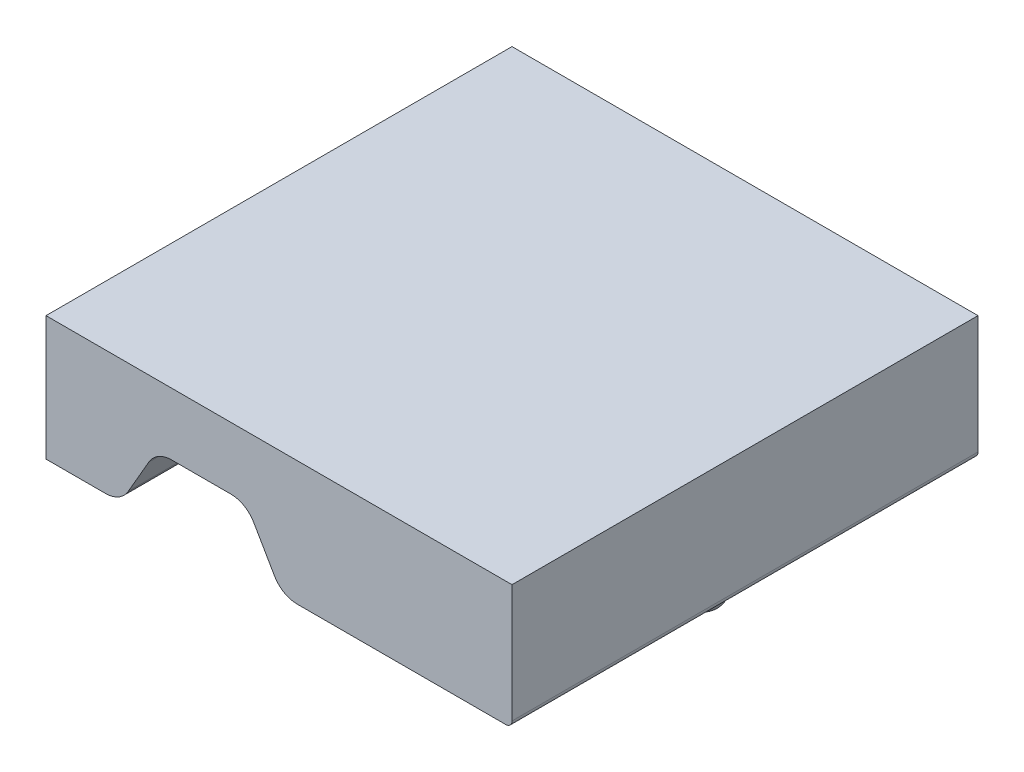
ISO-10303-21;
HEADER;
FILE_DESCRIPTION(('STEP AP214'),'2;1');
FILE_NAME('part.step','',(''),(''),'','','');
FILE_SCHEMA(('AUTOMOTIVE_DESIGN { 1 0 10303 214 1 1 1 1 }'));
ENDSEC;
DATA;
#1=APPLICATION_CONTEXT('core data for automotive mechanical design processes');
#2=APPLICATION_PROTOCOL_DEFINITION('international standard','automotive_design',2000,#1);
#3=PRODUCT_CONTEXT('',#1,'mechanical');
#4=PRODUCT('Part','Part','',(#3));
#5=PRODUCT_RELATED_PRODUCT_CATEGORY('part','',(#4));
#6=PRODUCT_DEFINITION_FORMATION('','',#4);
#7=PRODUCT_DEFINITION_CONTEXT('part definition',#1,'design');
#8=PRODUCT_DEFINITION('design','',#6,#7);
#9=PRODUCT_DEFINITION_SHAPE('','',#8);
#10=(LENGTH_UNIT() NAMED_UNIT(*) SI_UNIT(.MILLI.,.METRE.));
#11=(NAMED_UNIT(*) PLANE_ANGLE_UNIT() SI_UNIT($,.RADIAN.));
#12=(NAMED_UNIT(*) SI_UNIT($,.STERADIAN.) SOLID_ANGLE_UNIT());
#13=UNCERTAINTY_MEASURE_WITH_UNIT(LENGTH_MEASURE(1.E-05),#10,'distance_accuracy_value','');
#14=(GEOMETRIC_REPRESENTATION_CONTEXT(3) GLOBAL_UNCERTAINTY_ASSIGNED_CONTEXT((#13)) GLOBAL_UNIT_ASSIGNED_CONTEXT((#10,
#11,#12)) REPRESENTATION_CONTEXT('',''));
#15=CARTESIAN_POINT('',(0.,0.,0.));
#16=DIRECTION('',(0.,0.,1.));
#17=DIRECTION('',(1.,0.,0.));
#18=AXIS2_PLACEMENT_3D('',#15,#16,#17);
#19=CARTESIAN_POINT('',(-127.,203.2,-381.));
#20=DIRECTION('',(0.,0.,1.));
#21=DIRECTION('',(1.,0.,0.));
#22=AXIS2_PLACEMENT_3D('',#19,#20,#21);
#23=PLANE('',#22);
#24=DIRECTION('',(0.,-1.,0.));
#25=VECTOR('',#24,1.);
#26=CARTESIAN_POINT('',(635.,203.2,-381.));
#27=LINE('',#26,#25);
#28=CARTESIAN_POINT('',(635.,203.2,-381.));
#29=VERTEX_POINT('',#28);
#30=CARTESIAN_POINT('',(635.,10.16,-381.));
#31=VERTEX_POINT('',#30);
#32=EDGE_CURVE('E303',#29,#31,#27,.T.);
#33=ORIENTED_EDGE('',*,*,#32,.T.);
#34=CARTESIAN_POINT('',(624.84,10.16,-381.));
#35=DIRECTION('',(0.,0.,1.));
#36=DIRECTION('',(1.,0.,0.));
#37=AXIS2_PLACEMENT_3D('',#34,#35,#36);
#38=CIRCLE('',#37,10.16);
#39=CARTESIAN_POINT('',(624.84,0.,-381.));
#40=VERTEX_POINT('',#39);
#41=EDGE_CURVE('E56',#31,#40,#38,.F.);
#42=ORIENTED_EDGE('',*,*,#41,.T.);
#43=DIRECTION('',(-1.,0.,0.));
#44=VECTOR('',#43,1.);
#45=CARTESIAN_POINT('',(-127.,0.,-381.));
#46=LINE('',#45,#44);
#47=CARTESIAN_POINT('',(283.912256160357,0.,-381.));
#48=VERTEX_POINT('',#47);
#49=EDGE_CURVE('E286',#40,#48,#46,.T.);
#50=ORIENTED_EDGE('',*,*,#49,.T.);
#51=CARTESIAN_POINT('',(283.912256160357,43.18,-381.));
#52=DIRECTION('',(0.,0.,1.));
#53=DIRECTION('',(1.,0.,0.));
#54=AXIS2_PLACEMENT_3D('',#51,#52,#53);
#55=CIRCLE('',#54,43.18);
#56=CARTESIAN_POINT('',(246.517279224945,21.59,-381.));
#57=VERTEX_POINT('',#56);
#58=EDGE_CURVE('E359',#48,#57,#55,.F.);
#59=ORIENTED_EDGE('',*,*,#58,.T.);
#60=DIRECTION('',(-0.500000000000001,0.866025403784438,0.));
#61=VECTOR('',#60,1.);
#62=CARTESIAN_POINT('',(273.646968374165,-25.4000000000001,-381.));
#63=LINE('',#62,#61);
#64=CARTESIAN_POINT('',(212.788476498887,80.0100000000001,-381.));
#65=VERTEX_POINT('',#64);
#66=EDGE_CURVE('E242',#57,#65,#63,.T.);
#67=ORIENTED_EDGE('',*,*,#66,.T.);
#68=CARTESIAN_POINT('',(175.393499563474,58.42,-381.));
#69=DIRECTION('',(0.,0.,1.));
#70=DIRECTION('',(1.,0.,0.));
#71=AXIS2_PLACEMENT_3D('',#68,#69,#70);
#72=CIRCLE('',#71,43.18);
#73=CARTESIAN_POINT('',(175.393499563474,101.6,-381.));
#74=VERTEX_POINT('',#73);
#75=EDGE_CURVE('E394',#65,#74,#72,.T.);
#76=ORIENTED_EDGE('',*,*,#75,.T.);
#77=DIRECTION('',(-1.,0.,0.));
#78=VECTOR('',#77,1.);
#79=CARTESIAN_POINT('',(200.323484187082,101.6,-381.));
#80=LINE('',#79,#78);
#81=CARTESIAN_POINT('',(78.6065004365256,101.6,-381.));
#82=VERTEX_POINT('',#81);
#83=EDGE_CURVE('E250',#74,#82,#80,.T.);
#84=ORIENTED_EDGE('',*,*,#83,.T.);
#85=CARTESIAN_POINT('',(78.6065004365255,58.42,-381.));
#86=DIRECTION('',(0.,0.,1.));
#87=DIRECTION('',(1.,0.,0.));
#88=AXIS2_PLACEMENT_3D('',#85,#86,#87);
#89=CIRCLE('',#88,43.18);
#90=CARTESIAN_POINT('',(41.2115235011134,80.0099999999999,-381.));
#91=VERTEX_POINT('',#90);
#92=EDGE_CURVE('E389',#82,#91,#89,.T.);
#93=ORIENTED_EDGE('',*,*,#92,.T.);
#94=DIRECTION('',(-0.499999999999999,-0.866025403784439,0.));
#95=VECTOR('',#94,1.);
#96=CARTESIAN_POINT('',(53.6765158129175,101.6,-381.));
#97=LINE('',#96,#95);
#98=CARTESIAN_POINT('',(7.48272077505559,21.59,-381.));
#99=VERTEX_POINT('',#98);
#100=EDGE_CURVE('E259',#91,#99,#97,.T.);
#101=ORIENTED_EDGE('',*,*,#100,.T.);
#102=CARTESIAN_POINT('',(-29.9122561603565,43.18,-381.));
#103=DIRECTION('',(0.,0.,1.));
#104=DIRECTION('',(1.,0.,0.));
#105=AXIS2_PLACEMENT_3D('',#102,#103,#104);
#106=CIRCLE('',#105,43.18);
#107=CARTESIAN_POINT('',(-29.9122561603565,0.,-381.));
#108=VERTEX_POINT('',#107);
#109=EDGE_CURVE('E361',#99,#108,#106,.F.);
#110=ORIENTED_EDGE('',*,*,#109,.T.);
#111=CARTESIAN_POINT('',(-127.,0.,-381.));
#112=VERTEX_POINT('',#111);
#113=EDGE_CURVE('E299',#108,#112,#46,.T.);
#114=ORIENTED_EDGE('',*,*,#113,.T.);
#115=DIRECTION('',(0.,-1.,0.));
#116=VECTOR('',#115,1.);
#117=CARTESIAN_POINT('',(-127.,203.2,-381.));
#118=LINE('',#117,#116);
#119=CARTESIAN_POINT('',(-127.,203.2,-381.));
#120=VERTEX_POINT('',#119);
#121=EDGE_CURVE('E292',#120,#112,#118,.T.);
#122=ORIENTED_EDGE('',*,*,#121,.F.);
#123=DIRECTION('',(-1.,0.,0.));
#124=VECTOR('',#123,1.);
#125=CARTESIAN_POINT('',(-127.,203.2,-381.));
#126=LINE('',#125,#124);
#127=EDGE_CURVE('E290',#29,#120,#126,.T.);
#128=ORIENTED_EDGE('',*,*,#127,.F.);
#129=EDGE_LOOP('',(#33,#42,#50,#59,#67,#76,#84,#93,#101,#110,#114,#122,#128));
#130=FACE_BOUND('',#129,.T.);
#131=ADVANCED_FACE('F34',(#130),#23,.F.);
#132=CARTESIAN_POINT('',(0.,0.,0.));
#133=DIRECTION('',(0.,1.,0.));
#134=DIRECTION('',(0.,0.,1.));
#135=AXIS2_PLACEMENT_3D('',#132,#133,#134);
#136=PLANE('',#135);
#137=CARTESIAN_POINT('',(558.8,0.,0.));
#138=DIRECTION('',(0.,1.,0.));
#139=DIRECTION('',(0.,0.,1.));
#140=AXIS2_PLACEMENT_3D('',#137,#138,#139);
#141=CIRCLE('',#140,50.8);
#142=CARTESIAN_POINT('',(558.8,0.,50.8));
#143=VERTEX_POINT('',#142);
#144=EDGE_CURVE('E396',#143,#143,#141,.F.);
#145=ORIENTED_EDGE('',*,*,#144,.F.);
#146=EDGE_LOOP('',(#145));
#147=FACE_BOUND('',#146,.T.);
#148=DIRECTION('',(1.,0.,0.));
#149=VECTOR('',#148,1.);
#150=CARTESIAN_POINT('',(25.4000000000001,0.,-254.));
#151=LINE('',#150,#149);
#152=CARTESIAN_POINT('',(25.4000000000001,0.,-254.));
#153=VERTEX_POINT('',#152);
#154=CARTESIAN_POINT('',(228.6,0.,-254.));
#155=VERTEX_POINT('',#154);
#156=EDGE_CURVE('E236',#153,#155,#151,.T.);
#157=ORIENTED_EDGE('',*,*,#156,.F.);
#158=DIRECTION('',(0.,0.,-1.));
#159=VECTOR('',#158,1.);
#160=CARTESIAN_POINT('',(25.4000000000001,0.,254.));
#161=LINE('',#160,#159);
#162=CARTESIAN_POINT('',(25.4000000000001,0.,254.));
#163=VERTEX_POINT('',#162);
#164=EDGE_CURVE('E207',#163,#153,#161,.T.);
#165=ORIENTED_EDGE('',*,*,#164,.F.);
#166=DIRECTION('',(-1.,0.,0.));
#167=VECTOR('',#166,1.);
#168=CARTESIAN_POINT('',(25.4000000000001,0.,254.));
#169=LINE('',#168,#167);
#170=CARTESIAN_POINT('',(228.6,0.,254.));
#171=VERTEX_POINT('',#170);
#172=EDGE_CURVE('E224',#171,#163,#169,.T.);
#173=ORIENTED_EDGE('',*,*,#172,.F.);
#174=DIRECTION('',(0.,0.,1.));
#175=VECTOR('',#174,1.);
#176=CARTESIAN_POINT('',(228.6,0.,254.));
#177=LINE('',#176,#175);
#178=EDGE_CURVE('E227',#155,#171,#177,.T.);
#179=ORIENTED_EDGE('',*,*,#178,.F.);
#180=EDGE_LOOP('',(#157,#165,#173,#179));
#181=FACE_BOUND('',#180,.T.);
#182=ORIENTED_EDGE('',*,*,#49,.F.);
#183=DIRECTION('',(0.,0.,-1.));
#184=VECTOR('',#183,1.);
#185=CARTESIAN_POINT('',(624.84,0.,0.));
#186=LINE('',#185,#184);
#187=CARTESIAN_POINT('',(624.84,0.,381.));
#188=VERTEX_POINT('',#187);
#189=EDGE_CURVE('E42',#40,#188,#186,.F.);
#190=ORIENTED_EDGE('',*,*,#189,.T.);
#191=DIRECTION('',(1.,0.,0.));
#192=VECTOR('',#191,1.);
#193=CARTESIAN_POINT('',(-127.,0.,381.));
#194=LINE('',#193,#192);
#195=CARTESIAN_POINT('',(283.912256160357,0.,381.));
#196=VERTEX_POINT('',#195);
#197=EDGE_CURVE('E295',#196,#188,#194,.T.);
#198=ORIENTED_EDGE('',*,*,#197,.F.);
#199=DIRECTION('',(0.,0.,-1.));
#200=VECTOR('',#199,1.);
#201=CARTESIAN_POINT('',(283.912256160357,0.,0.));
#202=LINE('',#201,#200);
#203=CARTESIAN_POINT('',(283.912256160357,0.,279.4));
#204=VERTEX_POINT('',#203);
#205=EDGE_CURVE('E342',#196,#204,#202,.T.);
#206=ORIENTED_EDGE('',*,*,#205,.T.);
#207=DIRECTION('',(1.,0.,0.));
#208=VECTOR('',#207,1.);
#209=CARTESIAN_POINT('',(0.,0.,279.4));
#210=LINE('',#209,#208);
#211=CARTESIAN_POINT('',(-29.9122561603565,0.,279.4));
#212=VERTEX_POINT('',#211);
#213=EDGE_CURVE('E311',#212,#204,#210,.T.);
#214=ORIENTED_EDGE('',*,*,#213,.F.);
#215=DIRECTION('',(0.,0.,1.));
#216=VECTOR('',#215,1.);
#217=CARTESIAN_POINT('',(-29.9122561603565,0.,0.));
#218=LINE('',#217,#216);
#219=CARTESIAN_POINT('',(-29.9122561603565,0.,381.));
#220=VERTEX_POINT('',#219);
#221=EDGE_CURVE('E339',#212,#220,#218,.T.);
#222=ORIENTED_EDGE('',*,*,#221,.T.);
#223=CARTESIAN_POINT('',(-127.,0.,381.));
#224=VERTEX_POINT('',#223);
#225=EDGE_CURVE('E296',#224,#220,#194,.T.);
#226=ORIENTED_EDGE('',*,*,#225,.F.);
#227=DIRECTION('',(0.,0.,1.));
#228=VECTOR('',#227,1.);
#229=CARTESIAN_POINT('',(-127.,0.,-381.));
#230=LINE('',#229,#228);
#231=EDGE_CURVE('E274',#112,#224,#230,.T.);
#232=ORIENTED_EDGE('',*,*,#231,.F.);
#233=ORIENTED_EDGE('',*,*,#113,.F.);
#234=DIRECTION('',(0.,0.,-1.));
#235=VECTOR('',#234,1.);
#236=CARTESIAN_POINT('',(-29.9122561603565,0.,-279.4));
#237=LINE('',#236,#235);
#238=CARTESIAN_POINT('',(-29.9122561603565,0.,-279.4));
#239=VERTEX_POINT('',#238);
#240=EDGE_CURVE('E336',#108,#239,#237,.F.);
#241=ORIENTED_EDGE('',*,*,#240,.T.);
#242=DIRECTION('',(-1.,0.,0.));
#243=VECTOR('',#242,1.);
#244=CARTESIAN_POINT('',(0.,0.,-279.4));
#245=LINE('',#244,#243);
#246=CARTESIAN_POINT('',(283.912256160357,0.,-279.4));
#247=VERTEX_POINT('',#246);
#248=EDGE_CURVE('E313',#247,#239,#245,.T.);
#249=ORIENTED_EDGE('',*,*,#248,.F.);
#250=DIRECTION('',(0.,0.,1.));
#251=VECTOR('',#250,1.);
#252=CARTESIAN_POINT('',(283.912256160357,0.,-381.));
#253=LINE('',#252,#251);
#254=EDGE_CURVE('E333',#247,#48,#253,.F.);
#255=ORIENTED_EDGE('',*,*,#254,.T.);
#256=EDGE_LOOP('',(#182,#190,#198,#206,#214,#222,#226,#232,#233,#241,#249,#255));
#257=FACE_BOUND('',#256,.T.);
#258=ADVANCED_FACE('F435',(#147,#181,#257),#136,.F.);
#259=CARTESIAN_POINT('',(-127.,203.2,-381.));
#260=DIRECTION('',(1.,0.,0.));
#261=DIRECTION('',(0.,0.,-1.));
#262=AXIS2_PLACEMENT_3D('',#259,#260,#261);
#263=PLANE('',#262);
#264=ORIENTED_EDGE('',*,*,#231,.T.);
#265=DIRECTION('',(0.,-1.,0.));
#266=VECTOR('',#265,1.);
#267=CARTESIAN_POINT('',(-127.,203.2,381.));
#268=LINE('',#267,#266);
#269=CARTESIAN_POINT('',(-127.,203.2,381.));
#270=VERTEX_POINT('',#269);
#271=EDGE_CURVE('E308',#270,#224,#268,.T.);
#272=ORIENTED_EDGE('',*,*,#271,.F.);
#273=DIRECTION('',(0.,0.,1.));
#274=VECTOR('',#273,1.);
#275=CARTESIAN_POINT('',(-127.,203.2,-381.));
#276=LINE('',#275,#274);
#277=EDGE_CURVE('E282',#120,#270,#276,.T.);
#278=ORIENTED_EDGE('',*,*,#277,.F.);
#279=ORIENTED_EDGE('',*,*,#121,.T.);
#280=EDGE_LOOP('',(#264,#272,#278,#279));
#281=FACE_BOUND('',#280,.T.);
#282=ADVANCED_FACE('F440',(#281),#263,.F.);
#283=CARTESIAN_POINT('',(-127.,203.2,381.));
#284=DIRECTION('',(0.,0.,-1.));
#285=DIRECTION('',(-1.,0.,0.));
#286=AXIS2_PLACEMENT_3D('',#283,#284,#285);
#287=PLANE('',#286);
#288=ORIENTED_EDGE('',*,*,#197,.T.);
#289=CARTESIAN_POINT('',(624.84,10.16,381.));
#290=DIRECTION('',(0.,0.,-1.));
#291=DIRECTION('',(-1.,0.,0.));
#292=AXIS2_PLACEMENT_3D('',#289,#290,#291);
#293=CIRCLE('',#292,10.16);
#294=CARTESIAN_POINT('',(635.,10.16,381.));
#295=VERTEX_POINT('',#294);
#296=EDGE_CURVE('E11',#188,#295,#293,.F.);
#297=ORIENTED_EDGE('',*,*,#296,.T.);
#298=DIRECTION('',(0.,-1.,0.));
#299=VECTOR('',#298,1.);
#300=CARTESIAN_POINT('',(635.,203.2,381.));
#301=LINE('',#300,#299);
#302=CARTESIAN_POINT('',(635.,203.2,381.));
#303=VERTEX_POINT('',#302);
#304=EDGE_CURVE('E305',#303,#295,#301,.T.);
#305=ORIENTED_EDGE('',*,*,#304,.F.);
#306=DIRECTION('',(1.,0.,0.));
#307=VECTOR('',#306,1.);
#308=CARTESIAN_POINT('',(-127.,203.2,381.));
#309=LINE('',#308,#307);
#310=EDGE_CURVE('E285',#270,#303,#309,.T.);
#311=ORIENTED_EDGE('',*,*,#310,.F.);
#312=ORIENTED_EDGE('',*,*,#271,.T.);
#313=ORIENTED_EDGE('',*,*,#225,.T.);
#314=CARTESIAN_POINT('',(-29.9122561603565,43.18,381.));
#315=DIRECTION('',(0.,0.,-1.));
#316=DIRECTION('',(-1.,0.,0.));
#317=AXIS2_PLACEMENT_3D('',#314,#315,#316);
#318=CIRCLE('',#317,43.18);
#319=CARTESIAN_POINT('',(7.48272077505559,21.59,381.));
#320=VERTEX_POINT('',#319);
#321=EDGE_CURVE('E345',#220,#320,#318,.F.);
#322=ORIENTED_EDGE('',*,*,#321,.T.);
#323=DIRECTION('',(-0.499999999999999,-0.866025403784439,0.));
#324=VECTOR('',#323,1.);
#325=CARTESIAN_POINT('',(53.6765158129175,101.6,381.));
#326=LINE('',#325,#324);
#327=CARTESIAN_POINT('',(41.2115235011134,80.0099999999999,381.));
#328=VERTEX_POINT('',#327);
#329=EDGE_CURVE('E268',#328,#320,#326,.T.);
#330=ORIENTED_EDGE('',*,*,#329,.F.);
#331=CARTESIAN_POINT('',(78.6065004365255,58.42,381.));
#332=DIRECTION('',(0.,0.,-1.));
#333=DIRECTION('',(-1.,0.,0.));
#334=AXIS2_PLACEMENT_3D('',#331,#332,#333);
#335=CIRCLE('',#334,43.18);
#336=CARTESIAN_POINT('',(78.6065004365256,101.6,381.));
#337=VERTEX_POINT('',#336);
#338=EDGE_CURVE('E385',#328,#337,#335,.T.);
#339=ORIENTED_EDGE('',*,*,#338,.T.);
#340=DIRECTION('',(-1.,0.,0.));
#341=VECTOR('',#340,1.);
#342=CARTESIAN_POINT('',(200.323484187082,101.6,381.));
#343=LINE('',#342,#341);
#344=CARTESIAN_POINT('',(175.393499563474,101.6,381.));
#345=VERTEX_POINT('',#344);
#346=EDGE_CURVE('E277',#345,#337,#343,.T.);
#347=ORIENTED_EDGE('',*,*,#346,.F.);
#348=CARTESIAN_POINT('',(175.393499563474,58.42,381.));
#349=DIRECTION('',(0.,0.,-1.));
#350=DIRECTION('',(-1.,0.,0.));
#351=AXIS2_PLACEMENT_3D('',#348,#349,#350);
#352=CIRCLE('',#351,43.18);
#353=CARTESIAN_POINT('',(212.788476498887,80.0100000000001,381.));
#354=VERTEX_POINT('',#353);
#355=EDGE_CURVE('E378',#345,#354,#352,.T.);
#356=ORIENTED_EDGE('',*,*,#355,.T.);
#357=DIRECTION('',(-0.500000000000001,0.866025403784438,0.));
#358=VECTOR('',#357,1.);
#359=CARTESIAN_POINT('',(273.646968374165,-25.4000000000001,381.));
#360=LINE('',#359,#358);
#361=CARTESIAN_POINT('',(246.517279224945,21.59,381.));
#362=VERTEX_POINT('',#361);
#363=EDGE_CURVE('E256',#362,#354,#360,.T.);
#364=ORIENTED_EDGE('',*,*,#363,.F.);
#365=CARTESIAN_POINT('',(283.912256160357,43.18,381.));
#366=DIRECTION('',(0.,0.,-1.));
#367=DIRECTION('',(-1.,0.,0.));
#368=AXIS2_PLACEMENT_3D('',#365,#366,#367);
#369=CIRCLE('',#368,43.18);
#370=EDGE_CURVE('E347',#362,#196,#369,.F.);
#371=ORIENTED_EDGE('',*,*,#370,.T.);
#372=EDGE_LOOP('',(#288,#297,#305,#311,#312,#313,#322,#330,#339,#347,#356,#364,#371));
#373=FACE_BOUND('',#372,.T.);
#374=ADVANCED_FACE('F426',(#373),#287,.F.);
#375=CARTESIAN_POINT('',(635.,203.2,-381.));
#376=DIRECTION('',(-1.,0.,0.));
#377=DIRECTION('',(0.,0.,1.));
#378=AXIS2_PLACEMENT_3D('',#375,#376,#377);
#379=PLANE('',#378);
#380=ORIENTED_EDGE('',*,*,#304,.T.);
#381=DIRECTION('',(0.,0.,-1.));
#382=VECTOR('',#381,1.);
#383=CARTESIAN_POINT('',(635.,10.16,-381.));
#384=LINE('',#383,#382);
#385=EDGE_CURVE('E408',#295,#31,#384,.T.);
#386=ORIENTED_EDGE('',*,*,#385,.T.);
#387=ORIENTED_EDGE('',*,*,#32,.F.);
#388=DIRECTION('',(0.,0.,-1.));
#389=VECTOR('',#388,1.);
#390=CARTESIAN_POINT('',(635.,203.2,-381.));
#391=LINE('',#390,#389);
#392=EDGE_CURVE('E288',#303,#29,#391,.T.);
#393=ORIENTED_EDGE('',*,*,#392,.F.);
#394=EDGE_LOOP('',(#380,#386,#387,#393));
#395=FACE_BOUND('',#394,.T.);
#396=ADVANCED_FACE('F414',(#395),#379,.F.);
#397=CARTESIAN_POINT('',(0.,203.2,0.));
#398=DIRECTION('',(0.,1.,0.));
#399=DIRECTION('',(0.,0.,1.));
#400=AXIS2_PLACEMENT_3D('',#397,#398,#399);
#401=PLANE('',#400);
#402=ORIENTED_EDGE('',*,*,#277,.T.);
#403=ORIENTED_EDGE('',*,*,#310,.T.);
#404=ORIENTED_EDGE('',*,*,#392,.T.);
#405=ORIENTED_EDGE('',*,*,#127,.T.);
#406=EDGE_LOOP('',(#402,#403,#404,#405));
#407=FACE_BOUND('',#406,.T.);
#408=ADVANCED_FACE('F423',(#407),#401,.T.);
#409=CARTESIAN_POINT('',(273.646968374165,-25.4000000000001,279.4));
#410=DIRECTION('',(0.866025403784438,0.500000000000001,0.));
#411=DIRECTION('',(-0.500000000000001,0.866025403784438,0.));
#412=AXIS2_PLACEMENT_3D('',#409,#410,#411);
#413=PLANE('',#412);
#414=ORIENTED_EDGE('',*,*,#363,.T.);
#415=DIRECTION('',(0.,0.,1.));
#416=VECTOR('',#415,1.);
#417=CARTESIAN_POINT('',(212.788476498887,80.01,279.4));
#418=LINE('',#417,#416);
#419=CARTESIAN_POINT('',(212.788476498887,80.0100000000001,279.4));
#420=VERTEX_POINT('',#419);
#421=EDGE_CURVE('E327',#354,#420,#418,.F.);
#422=ORIENTED_EDGE('',*,*,#421,.T.);
#423=DIRECTION('',(-0.500000000000001,0.866025403784438,0.));
#424=VECTOR('',#423,1.);
#425=CARTESIAN_POINT('',(273.646968374165,-25.4000000000001,279.4));
#426=LINE('',#425,#424);
#427=CARTESIAN_POINT('',(246.517279224945,21.59,279.4));
#428=VERTEX_POINT('',#427);
#429=EDGE_CURVE('E264',#428,#420,#426,.T.);
#430=ORIENTED_EDGE('',*,*,#429,.F.);
#431=DIRECTION('',(0.,0.,-1.));
#432=VECTOR('',#431,1.);
#433=CARTESIAN_POINT('',(246.517279224945,21.59,279.4));
#434=LINE('',#433,#432);
#435=EDGE_CURVE('E325',#428,#362,#434,.F.);
#436=ORIENTED_EDGE('',*,*,#435,.T.);
#437=EDGE_LOOP('',(#414,#422,#430,#436));
#438=FACE_BOUND('',#437,.T.);
#439=ADVANCED_FACE('F542',(#438),#413,.F.);
#440=CARTESIAN_POINT('',(53.6765158129175,101.6,279.4));
#441=DIRECTION('',(-0.866025403784439,0.499999999999999,0.));
#442=DIRECTION('',(-0.499999999999999,-0.866025403784439,0.));
#443=AXIS2_PLACEMENT_3D('',#440,#441,#442);
#444=PLANE('',#443);
#445=ORIENTED_EDGE('',*,*,#329,.T.);
#446=DIRECTION('',(0.,0.,1.));
#447=VECTOR('',#446,1.);
#448=CARTESIAN_POINT('',(7.48272077505561,21.59,279.4));
#449=LINE('',#448,#447);
#450=CARTESIAN_POINT('',(7.48272077505559,21.59,279.4));
#451=VERTEX_POINT('',#450);
#452=EDGE_CURVE('E352',#320,#451,#449,.F.);
#453=ORIENTED_EDGE('',*,*,#452,.T.);
#454=DIRECTION('',(-0.499999999999999,-0.866025403784439,0.));
#455=VECTOR('',#454,1.);
#456=CARTESIAN_POINT('',(53.6765158129175,101.6,279.4));
#457=LINE('',#456,#455);
#458=CARTESIAN_POINT('',(41.2115235011134,80.0099999999999,279.4));
#459=VERTEX_POINT('',#458);
#460=EDGE_CURVE('E271',#459,#451,#457,.T.);
#461=ORIENTED_EDGE('',*,*,#460,.F.);
#462=DIRECTION('',(0.,0.,1.));
#463=VECTOR('',#462,1.);
#464=CARTESIAN_POINT('',(41.2115235011135,80.01,381.));
#465=LINE('',#464,#463);
#466=EDGE_CURVE('E349',#459,#328,#465,.T.);
#467=ORIENTED_EDGE('',*,*,#466,.T.);
#468=EDGE_LOOP('',(#445,#453,#461,#467));
#469=FACE_BOUND('',#468,.T.);
#470=ADVANCED_FACE('F538',(#469),#444,.F.);
#471=CARTESIAN_POINT('',(0.,0.,279.4));
#472=DIRECTION('',(0.,0.,1.));
#473=DIRECTION('',(1.,0.,0.));
#474=AXIS2_PLACEMENT_3D('',#471,#472,#473);
#475=PLANE('',#474);
#476=CARTESIAN_POINT('',(127.,20.32,279.4));
#477=DIRECTION('',(0.,0.,1.));
#478=DIRECTION('',(1.,0.,0.));
#479=AXIS2_PLACEMENT_3D('',#476,#477,#478);
#480=CIRCLE('',#479,12.7);
#481=CARTESIAN_POINT('',(139.7,20.32,279.4));
#482=VERTEX_POINT('',#481);
#483=EDGE_CURVE('E320',#482,#482,#480,.T.);
#484=ORIENTED_EDGE('',*,*,#483,.F.);
#485=EDGE_LOOP('',(#484));
#486=FACE_BOUND('',#485,.T.);
#487=ORIENTED_EDGE('',*,*,#429,.T.);
#488=CARTESIAN_POINT('',(175.393499563474,58.42,279.4));
#489=DIRECTION('',(0.,0.,1.));
#490=DIRECTION('',(1.,0.,0.));
#491=AXIS2_PLACEMENT_3D('',#488,#489,#490);
#492=CIRCLE('',#491,43.18);
#493=CARTESIAN_POINT('',(175.393499563474,101.6,279.4));
#494=VERTEX_POINT('',#493);
#495=EDGE_CURVE('E331',#420,#494,#492,.T.);
#496=ORIENTED_EDGE('',*,*,#495,.T.);
#497=DIRECTION('',(-1.,0.,0.));
#498=VECTOR('',#497,1.);
#499=CARTESIAN_POINT('',(200.323484187082,101.6,279.4));
#500=LINE('',#499,#498);
#501=CARTESIAN_POINT('',(78.6065004365256,101.6,279.4));
#502=VERTEX_POINT('',#501);
#503=EDGE_CURVE('E267',#494,#502,#500,.T.);
#504=ORIENTED_EDGE('',*,*,#503,.T.);
#505=CARTESIAN_POINT('',(78.6065004365255,58.42,279.4));
#506=DIRECTION('',(0.,0.,1.));
#507=DIRECTION('',(1.,0.,0.));
#508=AXIS2_PLACEMENT_3D('',#505,#506,#507);
#509=CIRCLE('',#508,43.18);
#510=EDGE_CURVE('E329',#502,#459,#509,.T.);
#511=ORIENTED_EDGE('',*,*,#510,.T.);
#512=ORIENTED_EDGE('',*,*,#460,.T.);
#513=CARTESIAN_POINT('',(-29.9122561603565,43.18,279.4));
#514=DIRECTION('',(0.,0.,1.));
#515=DIRECTION('',(1.,0.,0.));
#516=AXIS2_PLACEMENT_3D('',#513,#514,#515);
#517=CIRCLE('',#516,43.18);
#518=EDGE_CURVE('E382',#451,#212,#517,.F.);
#519=ORIENTED_EDGE('',*,*,#518,.T.);
#520=ORIENTED_EDGE('',*,*,#213,.T.);
#521=CARTESIAN_POINT('',(283.912256160357,43.18,279.4));
#522=DIRECTION('',(0.,0.,1.));
#523=DIRECTION('',(1.,0.,0.));
#524=AXIS2_PLACEMENT_3D('',#521,#522,#523);
#525=CIRCLE('',#524,43.18);
#526=EDGE_CURVE('E380',#204,#428,#525,.F.);
#527=ORIENTED_EDGE('',*,*,#526,.T.);
#528=EDGE_LOOP('',(#487,#496,#504,#511,#512,#519,#520,#527));
#529=FACE_BOUND('',#528,.T.);
#530=ADVANCED_FACE('F535',(#486,#529),#475,.T.);
#531=CARTESIAN_POINT('',(200.323484187082,101.6,279.4));
#532=DIRECTION('',(0.,1.,0.));
#533=DIRECTION('',(-1.,0.,0.));
#534=AXIS2_PLACEMENT_3D('',#531,#532,#533);
#535=PLANE('',#534);
#536=ORIENTED_EDGE('',*,*,#503,.F.);
#537=DIRECTION('',(0.,0.,1.));
#538=VECTOR('',#537,1.);
#539=CARTESIAN_POINT('',(175.393499563474,101.6,381.));
#540=LINE('',#539,#538);
#541=EDGE_CURVE('E322',#494,#345,#540,.T.);
#542=ORIENTED_EDGE('',*,*,#541,.T.);
#543=ORIENTED_EDGE('',*,*,#346,.T.);
#544=DIRECTION('',(0.,0.,1.));
#545=VECTOR('',#544,1.);
#546=CARTESIAN_POINT('',(78.6065004365255,101.6,279.4));
#547=LINE('',#546,#545);
#548=EDGE_CURVE('E315',#337,#502,#547,.F.);
#549=ORIENTED_EDGE('',*,*,#548,.T.);
#550=EDGE_LOOP('',(#536,#542,#543,#549));
#551=FACE_BOUND('',#550,.T.);
#552=ADVANCED_FACE('F534',(#551),#535,.F.);
#553=CARTESIAN_POINT('',(273.646968374165,-25.4000000000001,-279.4));
#554=DIRECTION('',(-0.866025403784438,-0.500000000000001,0.));
#555=DIRECTION('',(0.500000000000001,-0.866025403784438,0.));
#556=AXIS2_PLACEMENT_3D('',#553,#554,#555);
#557=PLANE('',#556);
#558=ORIENTED_EDGE('',*,*,#66,.F.);
#559=DIRECTION('',(0.,0.,1.));
#560=VECTOR('',#559,1.);
#561=CARTESIAN_POINT('',(246.517279224945,21.59,-279.4));
#562=LINE('',#561,#560);
#563=CARTESIAN_POINT('',(246.517279224945,21.59,-279.4));
#564=VERTEX_POINT('',#563);
#565=EDGE_CURVE('E375',#57,#564,#562,.T.);
#566=ORIENTED_EDGE('',*,*,#565,.T.);
#567=DIRECTION('',(-0.500000000000001,0.866025403784438,0.));
#568=VECTOR('',#567,1.);
#569=CARTESIAN_POINT('',(273.646968374165,-25.4000000000001,-279.4));
#570=LINE('',#569,#568);
#571=CARTESIAN_POINT('',(212.788476498887,80.0100000000001,-279.4));
#572=VERTEX_POINT('',#571);
#573=EDGE_CURVE('E246',#564,#572,#570,.T.);
#574=ORIENTED_EDGE('',*,*,#573,.T.);
#575=DIRECTION('',(0.,0.,-1.));
#576=VECTOR('',#575,1.);
#577=CARTESIAN_POINT('',(212.788476498887,80.01,-381.));
#578=LINE('',#577,#576);
#579=EDGE_CURVE('E372',#572,#65,#578,.T.);
#580=ORIENTED_EDGE('',*,*,#579,.T.);
#581=EDGE_LOOP('',(#558,#566,#574,#580));
#582=FACE_BOUND('',#581,.T.);
#583=ADVANCED_FACE('F501',(#582),#557,.T.);
#584=CARTESIAN_POINT('',(53.6765158129175,101.6,-279.4));
#585=DIRECTION('',(0.866025403784439,-0.499999999999999,0.));
#586=DIRECTION('',(0.499999999999999,0.866025403784439,0.));
#587=AXIS2_PLACEMENT_3D('',#584,#585,#586);
#588=PLANE('',#587);
#589=DIRECTION('',(-0.499999999999999,-0.866025403784439,0.));
#590=VECTOR('',#589,1.);
#591=CARTESIAN_POINT('',(53.6765158129175,101.6,-279.4));
#592=LINE('',#591,#590);
#593=CARTESIAN_POINT('',(41.2115235011134,80.0099999999999,-279.4));
#594=VERTEX_POINT('',#593);
#595=CARTESIAN_POINT('',(7.48272077505559,21.59,-279.4));
#596=VERTEX_POINT('',#595);
#597=EDGE_CURVE('E249',#594,#596,#592,.T.);
#598=ORIENTED_EDGE('',*,*,#597,.T.);
#599=DIRECTION('',(0.,0.,-1.));
#600=VECTOR('',#599,1.);
#601=CARTESIAN_POINT('',(7.48272077505561,21.59,-381.));
#602=LINE('',#601,#600);
#603=EDGE_CURVE('E356',#596,#99,#602,.T.);
#604=ORIENTED_EDGE('',*,*,#603,.T.);
#605=ORIENTED_EDGE('',*,*,#100,.F.);
#606=DIRECTION('',(0.,0.,-1.));
#607=VECTOR('',#606,1.);
#608=CARTESIAN_POINT('',(41.2115235011135,80.01,-279.4));
#609=LINE('',#608,#607);
#610=EDGE_CURVE('E354',#91,#594,#609,.F.);
#611=ORIENTED_EDGE('',*,*,#610,.T.);
#612=EDGE_LOOP('',(#598,#604,#605,#611));
#613=FACE_BOUND('',#612,.T.);
#614=ADVANCED_FACE('F512',(#613),#588,.T.);
#615=CARTESIAN_POINT('',(0.,0.,-279.4));
#616=DIRECTION('',(0.,0.,-1.));
#617=DIRECTION('',(1.,0.,0.));
#618=AXIS2_PLACEMENT_3D('',#615,#616,#617);
#619=PLANE('',#618);
#620=CARTESIAN_POINT('',(127.,20.32,-279.4));
#621=DIRECTION('',(0.,0.,-1.));
#622=DIRECTION('',(-1.,0.,0.));
#623=AXIS2_PLACEMENT_3D('',#620,#621,#622);
#624=CIRCLE('',#623,12.7);
#625=CARTESIAN_POINT('',(114.3,20.32,-279.4));
#626=VERTEX_POINT('',#625);
#627=EDGE_CURVE('E230',#626,#626,#624,.T.);
#628=ORIENTED_EDGE('',*,*,#627,.F.);
#629=EDGE_LOOP('',(#628));
#630=FACE_BOUND('',#629,.T.);
#631=ORIENTED_EDGE('',*,*,#597,.F.);
#632=CARTESIAN_POINT('',(78.6065004365255,58.42,-279.4));
#633=DIRECTION('',(0.,0.,-1.));
#634=DIRECTION('',(-1.,0.,0.));
#635=AXIS2_PLACEMENT_3D('',#632,#633,#634);
#636=CIRCLE('',#635,43.18);
#637=CARTESIAN_POINT('',(78.6065004365256,101.6,-279.4));
#638=VERTEX_POINT('',#637);
#639=EDGE_CURVE('E370',#594,#638,#636,.T.);
#640=ORIENTED_EDGE('',*,*,#639,.T.);
#641=DIRECTION('',(-1.,0.,0.));
#642=VECTOR('',#641,1.);
#643=CARTESIAN_POINT('',(200.323484187082,101.6,-279.4));
#644=LINE('',#643,#642);
#645=CARTESIAN_POINT('',(175.393499563474,101.6,-279.4));
#646=VERTEX_POINT('',#645);
#647=EDGE_CURVE('E253',#646,#638,#644,.T.);
#648=ORIENTED_EDGE('',*,*,#647,.F.);
#649=CARTESIAN_POINT('',(175.393499563474,58.42,-279.4));
#650=DIRECTION('',(0.,0.,-1.));
#651=DIRECTION('',(-1.,0.,0.));
#652=AXIS2_PLACEMENT_3D('',#649,#650,#651);
#653=CIRCLE('',#652,43.18);
#654=EDGE_CURVE('E368',#646,#572,#653,.T.);
#655=ORIENTED_EDGE('',*,*,#654,.T.);
#656=ORIENTED_EDGE('',*,*,#573,.F.);
#657=CARTESIAN_POINT('',(283.912256160357,43.18,-279.4));
#658=DIRECTION('',(0.,0.,-1.));
#659=DIRECTION('',(-1.,0.,0.));
#660=AXIS2_PLACEMENT_3D('',#657,#658,#659);
#661=CIRCLE('',#660,43.18);
#662=EDGE_CURVE('E391',#564,#247,#661,.F.);
#663=ORIENTED_EDGE('',*,*,#662,.T.);
#664=ORIENTED_EDGE('',*,*,#248,.T.);
#665=CARTESIAN_POINT('',(-29.9122561603565,43.18,-279.4));
#666=DIRECTION('',(0.,0.,-1.));
#667=DIRECTION('',(-1.,0.,0.));
#668=AXIS2_PLACEMENT_3D('',#665,#666,#667);
#669=CIRCLE('',#668,43.18);
#670=EDGE_CURVE('E387',#239,#596,#669,.F.);
#671=ORIENTED_EDGE('',*,*,#670,.T.);
#672=EDGE_LOOP('',(#631,#640,#648,#655,#656,#663,#664,#671));
#673=FACE_BOUND('',#672,.T.);
#674=ADVANCED_FACE('F498',(#630,#673),#619,.T.);
#675=CARTESIAN_POINT('',(200.323484187082,101.6,-279.4));
#676=DIRECTION('',(0.,-1.,0.));
#677=DIRECTION('',(1.,0.,0.));
#678=AXIS2_PLACEMENT_3D('',#675,#676,#677);
#679=PLANE('',#678);
#680=ORIENTED_EDGE('',*,*,#647,.T.);
#681=DIRECTION('',(0.,0.,-1.));
#682=VECTOR('',#681,1.);
#683=CARTESIAN_POINT('',(78.6065004365255,101.6,-381.));
#684=LINE('',#683,#682);
#685=EDGE_CURVE('E365',#638,#82,#684,.T.);
#686=ORIENTED_EDGE('',*,*,#685,.T.);
#687=ORIENTED_EDGE('',*,*,#83,.F.);
#688=DIRECTION('',(0.,0.,-1.));
#689=VECTOR('',#688,1.);
#690=CARTESIAN_POINT('',(175.393499563474,101.6,-279.4));
#691=LINE('',#690,#689);
#692=EDGE_CURVE('E363',#74,#646,#691,.F.);
#693=ORIENTED_EDGE('',*,*,#692,.T.);
#694=EDGE_LOOP('',(#680,#686,#687,#693));
#695=FACE_BOUND('',#694,.T.);
#696=ADVANCED_FACE('F518',(#695),#679,.T.);
#697=CARTESIAN_POINT('',(25.4000000000001,76.2,254.));
#698=DIRECTION('',(-1.,0.,0.));
#699=DIRECTION('',(0.,0.,1.));
#700=AXIS2_PLACEMENT_3D('',#697,#698,#699);
#701=PLANE('',#700);
#702=ORIENTED_EDGE('',*,*,#164,.T.);
#703=DIRECTION('',(0.,-1.,0.));
#704=VECTOR('',#703,1.);
#705=CARTESIAN_POINT('',(25.4000000000001,76.2,-254.));
#706=LINE('',#705,#704);
#707=CARTESIAN_POINT('',(25.4000000000001,76.2,-254.));
#708=VERTEX_POINT('',#707);
#709=EDGE_CURVE('E200',#708,#153,#706,.T.);
#710=ORIENTED_EDGE('',*,*,#709,.F.);
#711=DIRECTION('',(0.,0.,-1.));
#712=VECTOR('',#711,1.);
#713=CARTESIAN_POINT('',(25.4000000000001,76.2,254.));
#714=LINE('',#713,#712);
#715=CARTESIAN_POINT('',(25.4000000000001,76.2,254.));
#716=VERTEX_POINT('',#715);
#717=EDGE_CURVE('E204',#716,#708,#714,.T.);
#718=ORIENTED_EDGE('',*,*,#717,.F.);
#719=DIRECTION('',(0.,-1.,0.));
#720=VECTOR('',#719,1.);
#721=CARTESIAN_POINT('',(25.4000000000001,76.2,254.));
#722=LINE('',#721,#720);
#723=EDGE_CURVE('E240',#716,#163,#722,.T.);
#724=ORIENTED_EDGE('',*,*,#723,.T.);
#725=EDGE_LOOP('',(#702,#710,#718,#724));
#726=FACE_BOUND('',#725,.T.);
#727=ADVANCED_FACE('F202',(#726),#701,.F.);
#728=CARTESIAN_POINT('',(25.4000000000001,76.2,254.));
#729=DIRECTION('',(0.,0.,1.));
#730=DIRECTION('',(1.,0.,0.));
#731=AXIS2_PLACEMENT_3D('',#728,#729,#730);
#732=PLANE('',#731);
#733=CARTESIAN_POINT('',(127.,20.32,254.));
#734=DIRECTION('',(0.,0.,1.));
#735=DIRECTION('',(1.,0.,0.));
#736=AXIS2_PLACEMENT_3D('',#733,#734,#735);
#737=CIRCLE('',#736,12.7);
#738=CARTESIAN_POINT('',(139.7,20.32,254.));
#739=VERTEX_POINT('',#738);
#740=EDGE_CURVE('E319',#739,#739,#737,.T.);
#741=ORIENTED_EDGE('',*,*,#740,.T.);
#742=EDGE_LOOP('',(#741));
#743=FACE_BOUND('',#742,.T.);
#744=ORIENTED_EDGE('',*,*,#172,.T.);
#745=ORIENTED_EDGE('',*,*,#723,.F.);
#746=DIRECTION('',(-1.,0.,0.));
#747=VECTOR('',#746,1.);
#748=CARTESIAN_POINT('',(25.4000000000001,76.2,254.));
#749=LINE('',#748,#747);
#750=CARTESIAN_POINT('',(228.6,76.2,254.));
#751=VERTEX_POINT('',#750);
#752=EDGE_CURVE('E212',#751,#716,#749,.T.);
#753=ORIENTED_EDGE('',*,*,#752,.F.);
#754=DIRECTION('',(0.,-1.,0.));
#755=VECTOR('',#754,1.);
#756=CARTESIAN_POINT('',(228.6,76.2,254.));
#757=LINE('',#756,#755);
#758=EDGE_CURVE('E243',#751,#171,#757,.T.);
#759=ORIENTED_EDGE('',*,*,#758,.T.);
#760=EDGE_LOOP('',(#744,#745,#753,#759));
#761=FACE_BOUND('',#760,.T.);
#762=ADVANCED_FACE('F525',(#743,#761),#732,.F.);
#763=CARTESIAN_POINT('',(228.6,76.2,254.));
#764=DIRECTION('',(1.,0.,0.));
#765=DIRECTION('',(0.,0.,-1.));
#766=AXIS2_PLACEMENT_3D('',#763,#764,#765);
#767=PLANE('',#766);
#768=ORIENTED_EDGE('',*,*,#178,.T.);
#769=ORIENTED_EDGE('',*,*,#758,.F.);
#770=DIRECTION('',(0.,0.,1.));
#771=VECTOR('',#770,1.);
#772=CARTESIAN_POINT('',(228.6,76.2,254.));
#773=LINE('',#772,#771);
#774=CARTESIAN_POINT('',(228.6,76.2,-254.));
#775=VERTEX_POINT('',#774);
#776=EDGE_CURVE('E220',#775,#751,#773,.T.);
#777=ORIENTED_EDGE('',*,*,#776,.F.);
#778=DIRECTION('',(0.,-1.,0.));
#779=VECTOR('',#778,1.);
#780=CARTESIAN_POINT('',(228.6,76.2,-254.));
#781=LINE('',#780,#779);
#782=EDGE_CURVE('E211',#775,#155,#781,.T.);
#783=ORIENTED_EDGE('',*,*,#782,.T.);
#784=EDGE_LOOP('',(#768,#769,#777,#783));
#785=FACE_BOUND('',#784,.T.);
#786=ADVANCED_FACE('F747',(#785),#767,.F.);
#787=CARTESIAN_POINT('',(25.4000000000001,76.2,-254.));
#788=DIRECTION('',(0.,0.,-1.));
#789=DIRECTION('',(-1.,0.,0.));
#790=AXIS2_PLACEMENT_3D('',#787,#788,#789);
#791=PLANE('',#790);
#792=CARTESIAN_POINT('',(127.,20.32,-254.));
#793=DIRECTION('',(0.,0.,-1.));
#794=DIRECTION('',(-1.,0.,0.));
#795=AXIS2_PLACEMENT_3D('',#792,#793,#794);
#796=CIRCLE('',#795,12.7);
#797=CARTESIAN_POINT('',(114.3,20.32,-254.));
#798=VERTEX_POINT('',#797);
#799=EDGE_CURVE('E316',#798,#798,#796,.T.);
#800=ORIENTED_EDGE('',*,*,#799,.T.);
#801=EDGE_LOOP('',(#800));
#802=FACE_BOUND('',#801,.T.);
#803=ORIENTED_EDGE('',*,*,#156,.T.);
#804=ORIENTED_EDGE('',*,*,#782,.F.);
#805=DIRECTION('',(1.,0.,0.));
#806=VECTOR('',#805,1.);
#807=CARTESIAN_POINT('',(25.4000000000001,76.2,-254.));
#808=LINE('',#807,#806);
#809=EDGE_CURVE('E215',#708,#775,#808,.T.);
#810=ORIENTED_EDGE('',*,*,#809,.F.);
#811=ORIENTED_EDGE('',*,*,#709,.T.);
#812=EDGE_LOOP('',(#803,#804,#810,#811));
#813=FACE_BOUND('',#812,.T.);
#814=ADVANCED_FACE('F216',(#802,#813),#791,.F.);
#815=CARTESIAN_POINT('',(0.,76.2,0.));
#816=DIRECTION('',(0.,-1.,0.));
#817=DIRECTION('',(0.,0.,-1.));
#818=AXIS2_PLACEMENT_3D('',#815,#816,#817);
#819=PLANE('',#818);
#820=ORIENTED_EDGE('',*,*,#717,.T.);
#821=ORIENTED_EDGE('',*,*,#809,.T.);
#822=ORIENTED_EDGE('',*,*,#776,.T.);
#823=ORIENTED_EDGE('',*,*,#752,.T.);
#824=EDGE_LOOP('',(#820,#821,#822,#823));
#825=FACE_BOUND('',#824,.T.);
#826=ADVANCED_FACE('F222',(#825),#819,.T.);
#827=CARTESIAN_POINT('',(127.,20.32,-381.));
#828=DIRECTION('',(0.,0.,1.));
#829=DIRECTION('',(1.,0.,0.));
#830=AXIS2_PLACEMENT_3D('',#827,#828,#829);
#831=CYLINDRICAL_SURFACE('',#830,12.7);
#832=ORIENTED_EDGE('',*,*,#627,.T.);
#833=EDGE_LOOP('',(#832));
#834=FACE_BOUND('',#833,.T.);
#835=ORIENTED_EDGE('',*,*,#799,.F.);
#836=EDGE_LOOP('',(#835));
#837=FACE_BOUND('',#836,.T.);
#838=ADVANCED_FACE('F741',(#834,#837),#831,.F.);
#839=ORIENTED_EDGE('',*,*,#483,.T.);
#840=EDGE_LOOP('',(#839));
#841=FACE_BOUND('',#840,.T.);
#842=ORIENTED_EDGE('',*,*,#740,.F.);
#843=EDGE_LOOP('',(#842));
#844=FACE_BOUND('',#843,.T.);
#845=ADVANCED_FACE('F456',(#841,#844),#831,.F.);
#846=CARTESIAN_POINT('',(175.393499563474,58.42,279.4));
#847=DIRECTION('',(0.,0.,-1.));
#848=DIRECTION('',(-1.,0.,0.));
#849=AXIS2_PLACEMENT_3D('',#846,#847,#848);
#850=CYLINDRICAL_SURFACE('',#849,43.18);
#851=ORIENTED_EDGE('',*,*,#495,.F.);
#852=ORIENTED_EDGE('',*,*,#421,.F.);
#853=ORIENTED_EDGE('',*,*,#355,.F.);
#854=ORIENTED_EDGE('',*,*,#541,.F.);
#855=EDGE_LOOP('',(#851,#852,#853,#854));
#856=FACE_BOUND('',#855,.T.);
#857=ADVANCED_FACE('F452',(#856),#850,.F.);
#858=CARTESIAN_POINT('',(283.912256160357,43.18,0.));
#859=DIRECTION('',(0.,0.,-1.));
#860=DIRECTION('',(-1.,0.,0.));
#861=AXIS2_PLACEMENT_3D('',#858,#859,#860);
#862=CYLINDRICAL_SURFACE('',#861,43.18);
#863=ORIENTED_EDGE('',*,*,#370,.F.);
#864=ORIENTED_EDGE('',*,*,#435,.F.);
#865=ORIENTED_EDGE('',*,*,#526,.F.);
#866=ORIENTED_EDGE('',*,*,#205,.F.);
#867=EDGE_LOOP('',(#863,#864,#865,#866));
#868=FACE_BOUND('',#867,.T.);
#869=ADVANCED_FACE('F455',(#868),#862,.T.);
#870=CARTESIAN_POINT('',(-29.9122561603565,43.18,0.));
#871=DIRECTION('',(0.,0.,1.));
#872=DIRECTION('',(1.,0.,0.));
#873=AXIS2_PLACEMENT_3D('',#870,#871,#872);
#874=CYLINDRICAL_SURFACE('',#873,43.18);
#875=ORIENTED_EDGE('',*,*,#518,.F.);
#876=ORIENTED_EDGE('',*,*,#452,.F.);
#877=ORIENTED_EDGE('',*,*,#321,.F.);
#878=ORIENTED_EDGE('',*,*,#221,.F.);
#879=EDGE_LOOP('',(#875,#876,#877,#878));
#880=FACE_BOUND('',#879,.T.);
#881=ADVANCED_FACE('F460',(#880),#874,.T.);
#882=CARTESIAN_POINT('',(78.6065004365255,58.42,279.4));
#883=DIRECTION('',(0.,0.,-1.));
#884=DIRECTION('',(-1.,0.,0.));
#885=AXIS2_PLACEMENT_3D('',#882,#883,#884);
#886=CYLINDRICAL_SURFACE('',#885,43.18);
#887=ORIENTED_EDGE('',*,*,#510,.F.);
#888=ORIENTED_EDGE('',*,*,#548,.F.);
#889=ORIENTED_EDGE('',*,*,#338,.F.);
#890=ORIENTED_EDGE('',*,*,#466,.F.);
#891=EDGE_LOOP('',(#887,#888,#889,#890));
#892=FACE_BOUND('',#891,.T.);
#893=ADVANCED_FACE('F464',(#892),#886,.F.);
#894=CARTESIAN_POINT('',(-29.9122561603565,43.18,-279.4));
#895=DIRECTION('',(0.,0.,1.));
#896=DIRECTION('',(1.,0.,0.));
#897=AXIS2_PLACEMENT_3D('',#894,#895,#896);
#898=CYLINDRICAL_SURFACE('',#897,43.18);
#899=ORIENTED_EDGE('',*,*,#670,.F.);
#900=ORIENTED_EDGE('',*,*,#240,.F.);
#901=ORIENTED_EDGE('',*,*,#109,.F.);
#902=ORIENTED_EDGE('',*,*,#603,.F.);
#903=EDGE_LOOP('',(#899,#900,#901,#902));
#904=FACE_BOUND('',#903,.T.);
#905=ADVANCED_FACE('F468',(#904),#898,.T.);
#906=CARTESIAN_POINT('',(78.6065004365255,58.42,-279.4));
#907=DIRECTION('',(0.,0.,1.));
#908=DIRECTION('',(1.,0.,0.));
#909=AXIS2_PLACEMENT_3D('',#906,#907,#908);
#910=CYLINDRICAL_SURFACE('',#909,43.18);
#911=ORIENTED_EDGE('',*,*,#639,.F.);
#912=ORIENTED_EDGE('',*,*,#610,.F.);
#913=ORIENTED_EDGE('',*,*,#92,.F.);
#914=ORIENTED_EDGE('',*,*,#685,.F.);
#915=EDGE_LOOP('',(#911,#912,#913,#914));
#916=FACE_BOUND('',#915,.T.);
#917=ADVANCED_FACE('F472',(#916),#910,.F.);
#918=CARTESIAN_POINT('',(283.912256160357,43.18,-279.4));
#919=DIRECTION('',(0.,0.,-1.));
#920=DIRECTION('',(-1.,0.,0.));
#921=AXIS2_PLACEMENT_3D('',#918,#919,#920);
#922=CYLINDRICAL_SURFACE('',#921,43.18);
#923=ORIENTED_EDGE('',*,*,#58,.F.);
#924=ORIENTED_EDGE('',*,*,#254,.F.);
#925=ORIENTED_EDGE('',*,*,#662,.F.);
#926=ORIENTED_EDGE('',*,*,#565,.F.);
#927=EDGE_LOOP('',(#923,#924,#925,#926));
#928=FACE_BOUND('',#927,.T.);
#929=ADVANCED_FACE('F476',(#928),#922,.T.);
#930=CARTESIAN_POINT('',(175.393499563474,58.42,-279.4));
#931=DIRECTION('',(0.,0.,1.));
#932=DIRECTION('',(1.,0.,0.));
#933=AXIS2_PLACEMENT_3D('',#930,#931,#932);
#934=CYLINDRICAL_SURFACE('',#933,43.18);
#935=ORIENTED_EDGE('',*,*,#654,.F.);
#936=ORIENTED_EDGE('',*,*,#692,.F.);
#937=ORIENTED_EDGE('',*,*,#75,.F.);
#938=ORIENTED_EDGE('',*,*,#579,.F.);
#939=EDGE_LOOP('',(#935,#936,#937,#938));
#940=FACE_BOUND('',#939,.T.);
#941=ADVANCED_FACE('F480',(#940),#934,.F.);
#942=CARTESIAN_POINT('',(558.8,-17.78,0.));
#943=DIRECTION('',(0.,1.,0.));
#944=DIRECTION('',(0.,0.,1.));
#945=AXIS2_PLACEMENT_3D('',#942,#943,#944);
#946=CYLINDRICAL_SURFACE('',#945,50.8);
#947=CARTESIAN_POINT('',(558.8,-7.62,0.));
#948=DIRECTION('',(0.,-1.,0.));
#949=DIRECTION('',(0.,0.,-1.));
#950=AXIS2_PLACEMENT_3D('',#947,#948,#949);
#951=CIRCLE('',#950,50.8);
#952=CARTESIAN_POINT('',(558.8,-7.62,-50.8));
#953=VERTEX_POINT('',#952);
#954=EDGE_CURVE('E405',#953,#953,#951,.F.);
#955=ORIENTED_EDGE('',*,*,#954,.T.);
#956=EDGE_LOOP('',(#955));
#957=FACE_BOUND('',#956,.T.);
#958=ORIENTED_EDGE('',*,*,#144,.T.);
#959=EDGE_LOOP('',(#958));
#960=FACE_BOUND('',#959,.T.);
#961=ADVANCED_FACE('F483',(#957,#960),#946,.T.);
#962=CARTESIAN_POINT('',(558.8,-17.78,0.));
#963=DIRECTION('',(0.,-1.,0.));
#964=DIRECTION('',(0.,0.,-1.));
#965=AXIS2_PLACEMENT_3D('',#962,#963,#964);
#966=PLANE('',#965);
#967=CARTESIAN_POINT('',(558.8,-17.78,0.));
#968=DIRECTION('',(0.,-1.,0.));
#969=DIRECTION('',(0.,0.,-1.));
#970=AXIS2_PLACEMENT_3D('',#967,#968,#969);
#971=CIRCLE('',#970,40.64);
#972=CARTESIAN_POINT('',(558.8,-17.78,-40.64));
#973=VERTEX_POINT('',#972);
#974=EDGE_CURVE('E402',#973,#973,#971,.T.);
#975=ORIENTED_EDGE('',*,*,#974,.T.);
#976=EDGE_LOOP('',(#975));
#977=FACE_BOUND('',#976,.T.);
#978=CARTESIAN_POINT('',(558.8,-17.78,0.));
#979=DIRECTION('',(0.,-1.,0.));
#980=DIRECTION('',(0.,0.,-1.));
#981=AXIS2_PLACEMENT_3D('',#978,#979,#980);
#982=CIRCLE('',#981,40.1320000000001);
#983=CARTESIAN_POINT('',(558.8,-17.78,-40.1320000000001));
#984=VERTEX_POINT('',#983);
#985=EDGE_CURVE('E399',#984,#984,#982,.T.);
#986=ORIENTED_EDGE('',*,*,#985,.F.);
#987=EDGE_LOOP('',(#986));
#988=FACE_BOUND('',#987,.T.);
#989=ADVANCED_FACE('F488',(#977,#988),#966,.T.);
#990=CARTESIAN_POINT('',(558.8,-41.148,0.));
#991=DIRECTION('',(0.,-1.,0.));
#992=DIRECTION('',(0.,0.,-1.));
#993=AXIS2_PLACEMENT_3D('',#990,#991,#992);
#994=CONICAL_SURFACE('',#993,30.0923009422678,0.448921390907645);
#995=CARTESIAN_POINT('',(558.8,-43.18,0.));
#996=DIRECTION('',(0.,-1.,0.));
#997=DIRECTION('',(0.,0.,-1.));
#998=AXIS2_PLACEMENT_3D('',#995,#996,#997);
#999=CIRCLE('',#998,31.0711670846142);
#1000=CARTESIAN_POINT('',(558.8,-43.18,-31.0711670846142));
#1001=VERTEX_POINT('',#1000);
#1002=EDGE_CURVE('E772',#1001,#1001,#999,.T.);
#1003=ORIENTED_EDGE('',*,*,#1002,.T.);
#1004=EDGE_LOOP('',(#1003));
#1005=FACE_BOUND('',#1004,.T.);
#1006=CARTESIAN_POINT('',(558.8,-41.148,0.));
#1007=DIRECTION('',(0.,-1.,0.));
#1008=DIRECTION('',(0.,0.,-1.));
#1009=AXIS2_PLACEMENT_3D('',#1006,#1007,#1008);
#1010=CIRCLE('',#1009,30.0923009422678);
#1011=CARTESIAN_POINT('',(558.8,-41.148,-30.0923009422678));
#1012=VERTEX_POINT('',#1011);
#1013=EDGE_CURVE('E769',#1012,#1012,#1010,.T.);
#1014=ORIENTED_EDGE('',*,*,#1013,.F.);
#1015=EDGE_LOOP('',(#1014));
#1016=FACE_BOUND('',#1015,.T.);
#1017=ADVANCED_FACE('F644',(#1005,#1016),#994,.F.);
#1018=CARTESIAN_POINT('',(558.8,-17.78,0.));
#1019=DIRECTION('',(0.,-1.,0.));
#1020=DIRECTION('',(1.,0.,0.));
#1021=AXIS2_PLACEMENT_3D('',#1018,#1019,#1020);
#1022=SPHERICAL_SURFACE('',#1021,40.1320000000001);
#1023=ORIENTED_EDGE('',*,*,#985,.T.);
#1024=EDGE_LOOP('',(#1023));
#1025=FACE_BOUND('',#1024,.T.);
#1026=ORIENTED_EDGE('',*,*,#1002,.F.);
#1027=EDGE_LOOP('',(#1026));
#1028=FACE_BOUND('',#1027,.T.);
#1029=ADVANCED_FACE('F649',(#1025,#1028),#1022,.T.);
#1030=CARTESIAN_POINT('',(558.8,-17.78,0.));
#1031=DIRECTION('',(-1.,0.,0.));
#1032=DIRECTION('',(0.,0.,1.));
#1033=AXIS2_PLACEMENT_3D('',#1030,#1031,#1032);
#1034=SPHERICAL_SURFACE('',#1033,38.1);
#1035=CARTESIAN_POINT('',(558.8,-17.78,0.));
#1036=DIRECTION('',(0.,-1.,0.));
#1037=DIRECTION('',(0.,0.,-1.));
#1038=AXIS2_PLACEMENT_3D('',#1035,#1036,#1037);
#1039=SPHERICAL_SURFACE('',#1038,38.1);
#1040=ORIENTED_EDGE('',*,*,#1013,.T.);
#1041=EDGE_LOOP('',(#1040));
#1042=FACE_BOUND('',#1041,.T.);
#1043=ADVANCED_FACE('F432',(#1042),#1039,.F.);
#1044=CARTESIAN_POINT('',(558.8,-7.62,0.));
#1045=DIRECTION('',(0.,-1.,0.));
#1046=DIRECTION('',(0.,0.,-1.));
#1047=AXIS2_PLACEMENT_3D('',#1044,#1045,#1046);
#1048=TOROIDAL_SURFACE('',#1047,40.64,10.16);
#1049=ORIENTED_EDGE('',*,*,#954,.F.);
#1050=EDGE_LOOP('',(#1049));
#1051=FACE_BOUND('',#1050,.T.);
#1052=ORIENTED_EDGE('',*,*,#974,.F.);
#1053=EDGE_LOOP('',(#1052));
#1054=FACE_BOUND('',#1053,.T.);
#1055=ADVANCED_FACE('F428',(#1051,#1054),#1048,.T.);
#1056=CARTESIAN_POINT('',(624.84,10.16,-381.));
#1057=DIRECTION('',(0.,0.,-1.));
#1058=DIRECTION('',(-1.,0.,0.));
#1059=AXIS2_PLACEMENT_3D('',#1056,#1057,#1058);
#1060=CYLINDRICAL_SURFACE('',#1059,10.16);
#1061=ORIENTED_EDGE('',*,*,#296,.F.);
#1062=ORIENTED_EDGE('',*,*,#189,.F.);
#1063=ORIENTED_EDGE('',*,*,#41,.F.);
#1064=ORIENTED_EDGE('',*,*,#385,.F.);
#1065=EDGE_LOOP('',(#1061,#1062,#1063,#1064));
#1066=FACE_BOUND('',#1065,.T.);
#1067=ADVANCED_FACE('F36',(#1066),#1060,.T.);
#1068=CLOSED_SHELL('',(#131,#258,#282,#374,#396,#408,#439,#470,#530,#552,#583,#614,#674,#696,
#727,#762,#786,#814,#826,#838,#845,#857,#869,#881,#893,#905,#917,#929,#941,#961,#989,#1017,
#1029,#1043,#1055,#1067));
#1069=MANIFOLD_SOLID_BREP('B2',#1068);
#1070=ADVANCED_BREP_SHAPE_REPRESENTATION('',(#18,#1069),#14);
#1071=SHAPE_DEFINITION_REPRESENTATION(#9,#1070);
ENDSEC;
END-ISO-10303-21;
